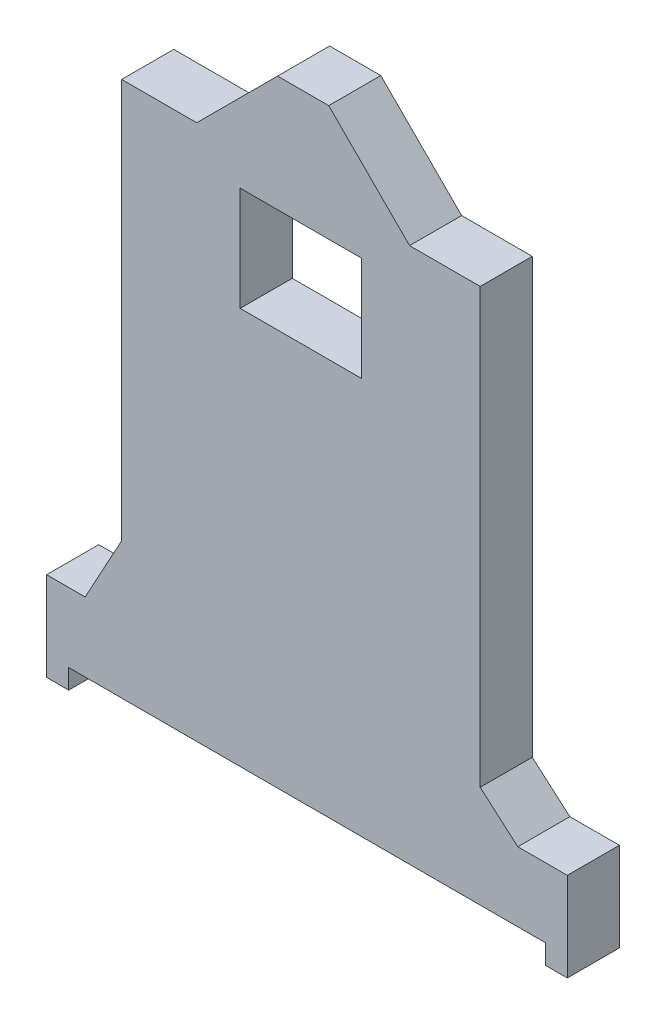
ISO-10303-21;
HEADER;
FILE_DESCRIPTION(('STEP AP214'),'2;1');
FILE_NAME('part.step','',(''),(''),'','','');
FILE_SCHEMA(('AUTOMOTIVE_DESIGN { 1 0 10303 214 1 1 1 1 }'));
ENDSEC;
DATA;
#1=APPLICATION_CONTEXT('core data for automotive mechanical design processes');
#2=APPLICATION_PROTOCOL_DEFINITION('international standard','automotive_design',2000,#1);
#3=PRODUCT_CONTEXT('',#1,'mechanical');
#4=PRODUCT('Part','Part','',(#3));
#5=PRODUCT_RELATED_PRODUCT_CATEGORY('part','',(#4));
#6=PRODUCT_DEFINITION_FORMATION('','',#4);
#7=PRODUCT_DEFINITION_CONTEXT('part definition',#1,'design');
#8=PRODUCT_DEFINITION('design','',#6,#7);
#9=PRODUCT_DEFINITION_SHAPE('','',#8);
#10=(LENGTH_UNIT() NAMED_UNIT(*) SI_UNIT(.MILLI.,.METRE.));
#11=(NAMED_UNIT(*) PLANE_ANGLE_UNIT() SI_UNIT($,.RADIAN.));
#12=(NAMED_UNIT(*) SI_UNIT($,.STERADIAN.) SOLID_ANGLE_UNIT());
#13=UNCERTAINTY_MEASURE_WITH_UNIT(LENGTH_MEASURE(1.E-05),#10,'distance_accuracy_value','');
#14=(GEOMETRIC_REPRESENTATION_CONTEXT(3) GLOBAL_UNCERTAINTY_ASSIGNED_CONTEXT((#13)) GLOBAL_UNIT_ASSIGNED_CONTEXT((#10,
#11,#12)) REPRESENTATION_CONTEXT('',''));
#15=CARTESIAN_POINT('',(0.,0.,0.));
#16=DIRECTION('',(0.,0.,1.));
#17=DIRECTION('',(1.,0.,0.));
#18=AXIS2_PLACEMENT_3D('',#15,#16,#17);
#19=CARTESIAN_POINT('',(461.082391295695,-1.67947600743342E-13,76.2));
#20=DIRECTION('',(1.,0.,0.));
#21=DIRECTION('',(0.,1.,0.));
#22=AXIS2_PLACEMENT_3D('',#19,#20,#21);
#23=PLANE('',#22);
#24=DIRECTION('',(0.,-1.,0.));
#25=VECTOR('',#24,1.);
#26=CARTESIAN_POINT('',(461.082391295695,-1.67947600743342E-13,0.));
#27=LINE('',#26,#25);
#28=CARTESIAN_POINT('',(461.082391295695,761.73124581928,0.));
#29=VERTEX_POINT('',#28);
#30=CARTESIAN_POINT('',(461.082391295695,609.33124581928,0.));
#31=VERTEX_POINT('',#30);
#32=EDGE_CURVE('E306',#29,#31,#27,.T.);
#33=ORIENTED_EDGE('',*,*,#32,.T.);
#34=DIRECTION('',(0.,0.,-1.));
#35=VECTOR('',#34,1.);
#36=CARTESIAN_POINT('',(461.082391295695,609.33124581928,76.2));
#37=LINE('',#36,#35);
#38=CARTESIAN_POINT('',(461.082391295695,609.33124581928,76.2));
#39=VERTEX_POINT('',#38);
#40=EDGE_CURVE('E111',#39,#31,#37,.T.);
#41=ORIENTED_EDGE('',*,*,#40,.F.);
#42=DIRECTION('',(0.,-1.,0.));
#43=VECTOR('',#42,1.);
#44=CARTESIAN_POINT('',(461.082391295695,-1.67947600743342E-13,76.2));
#45=LINE('',#44,#43);
#46=CARTESIAN_POINT('',(461.082391295695,761.73124581928,76.2));
#47=VERTEX_POINT('',#46);
#48=EDGE_CURVE('E443',#47,#39,#45,.T.);
#49=ORIENTED_EDGE('',*,*,#48,.F.);
#50=DIRECTION('',(0.,0.,-1.));
#51=VECTOR('',#50,1.);
#52=CARTESIAN_POINT('',(461.082391295695,761.73124581928,76.2));
#53=LINE('',#52,#51);
#54=EDGE_CURVE('E12',#47,#29,#53,.T.);
#55=ORIENTED_EDGE('',*,*,#54,.T.);
#56=EDGE_LOOP('',(#33,#41,#49,#55));
#57=FACE_BOUND('',#56,.T.);
#58=ADVANCED_FACE('F101',(#57),#23,.F.);
#59=CARTESIAN_POINT('',(0.,609.33124581928,76.2));
#60=DIRECTION('',(0.,1.,0.));
#61=DIRECTION('',(0.,0.,1.));
#62=AXIS2_PLACEMENT_3D('',#59,#60,#61);
#63=PLANE('',#62);
#64=DIRECTION('',(1.,0.,0.));
#65=VECTOR('',#64,1.);
#66=CARTESIAN_POINT('',(0.,609.33124581928,0.));
#67=LINE('',#66,#65);
#68=CARTESIAN_POINT('',(283.282391295695,609.33124581928,0.));
#69=VERTEX_POINT('',#68);
#70=EDGE_CURVE('E309',#69,#31,#67,.T.);
#71=ORIENTED_EDGE('',*,*,#70,.F.);
#72=DIRECTION('',(0.,0.,-1.));
#73=VECTOR('',#72,1.);
#74=CARTESIAN_POINT('',(283.282391295695,609.33124581928,76.2));
#75=LINE('',#74,#73);
#76=CARTESIAN_POINT('',(283.282391295695,609.33124581928,76.2));
#77=VERTEX_POINT('',#76);
#78=EDGE_CURVE('E317',#77,#69,#75,.T.);
#79=ORIENTED_EDGE('',*,*,#78,.F.);
#80=DIRECTION('',(1.,0.,0.));
#81=VECTOR('',#80,1.);
#82=CARTESIAN_POINT('',(0.,609.33124581928,76.2));
#83=LINE('',#82,#81);
#84=EDGE_CURVE('E448',#77,#39,#83,.T.);
#85=ORIENTED_EDGE('',*,*,#84,.T.);
#86=ORIENTED_EDGE('',*,*,#40,.T.);
#87=EDGE_LOOP('',(#71,#79,#85,#86));
#88=FACE_BOUND('',#87,.T.);
#89=ADVANCED_FACE('F455',(#88),#63,.T.);
#90=CARTESIAN_POINT('',(283.282391295695,1.03184590973541E-13,76.2));
#91=DIRECTION('',(1.,0.,0.));
#92=DIRECTION('',(0.,1.,0.));
#93=AXIS2_PLACEMENT_3D('',#90,#91,#92);
#94=PLANE('',#93);
#95=DIRECTION('',(0.,-1.,0.));
#96=VECTOR('',#95,1.);
#97=CARTESIAN_POINT('',(283.282391295695,1.03184590973541E-13,0.));
#98=LINE('',#97,#96);
#99=CARTESIAN_POINT('',(283.282391295695,761.73124581928,0.));
#100=VERTEX_POINT('',#99);
#101=EDGE_CURVE('E312',#100,#69,#98,.T.);
#102=ORIENTED_EDGE('',*,*,#101,.F.);
#103=DIRECTION('',(0.,0.,-1.));
#104=VECTOR('',#103,1.);
#105=CARTESIAN_POINT('',(283.282391295695,761.73124581928,76.2));
#106=LINE('',#105,#104);
#107=CARTESIAN_POINT('',(283.282391295695,761.73124581928,76.2));
#108=VERTEX_POINT('',#107);
#109=EDGE_CURVE('E120',#108,#100,#106,.T.);
#110=ORIENTED_EDGE('',*,*,#109,.F.);
#111=DIRECTION('',(0.,-1.,0.));
#112=VECTOR('',#111,1.);
#113=CARTESIAN_POINT('',(283.282391295695,1.03184590973541E-13,76.2));
#114=LINE('',#113,#112);
#115=EDGE_CURVE('E289',#108,#77,#114,.T.);
#116=ORIENTED_EDGE('',*,*,#115,.T.);
#117=ORIENTED_EDGE('',*,*,#78,.T.);
#118=EDGE_LOOP('',(#102,#110,#116,#117));
#119=FACE_BOUND('',#118,.T.);
#120=ADVANCED_FACE('F561',(#119),#94,.T.);
#121=CARTESIAN_POINT('',(0.,761.73124581928,76.2));
#122=DIRECTION('',(0.,1.,0.));
#123=DIRECTION('',(0.,0.,1.));
#124=AXIS2_PLACEMENT_3D('',#121,#122,#123);
#125=PLANE('',#124);
#126=DIRECTION('',(1.,0.,0.));
#127=VECTOR('',#126,1.);
#128=CARTESIAN_POINT('',(0.,761.73124581928,0.));
#129=LINE('',#128,#127);
#130=EDGE_CURVE('E303',#100,#29,#129,.T.);
#131=ORIENTED_EDGE('',*,*,#130,.T.);
#132=ORIENTED_EDGE('',*,*,#54,.F.);
#133=DIRECTION('',(1.,0.,0.));
#134=VECTOR('',#133,1.);
#135=CARTESIAN_POINT('',(0.,761.73124581928,76.2));
#136=LINE('',#135,#134);
#137=EDGE_CURVE('E449',#108,#47,#136,.T.);
#138=ORIENTED_EDGE('',*,*,#137,.F.);
#139=ORIENTED_EDGE('',*,*,#109,.T.);
#140=EDGE_LOOP('',(#131,#132,#138,#139));
#141=FACE_BOUND('',#140,.T.);
#142=ADVANCED_FACE('F565',(#141),#125,.F.);
#143=CARTESIAN_POINT('',(634.51829152491,0.,76.2));
#144=DIRECTION('',(-1.,0.,0.));
#145=DIRECTION('',(0.,0.,1.));
#146=AXIS2_PLACEMENT_3D('',#143,#144,#145);
#147=PLANE('',#146);
#148=DIRECTION('',(0.,1.,0.));
#149=VECTOR('',#148,1.);
#150=CARTESIAN_POINT('',(634.51829152491,0.,0.));
#151=LINE('',#150,#149);
#152=CARTESIAN_POINT('',(634.51829152491,177.963119360836,0.));
#153=VERTEX_POINT('',#152);
#154=CARTESIAN_POINT('',(634.51829152491,812.8,0.));
#155=VERTEX_POINT('',#154);
#156=EDGE_CURVE('E277',#153,#155,#151,.T.);
#157=ORIENTED_EDGE('',*,*,#156,.T.);
#158=DIRECTION('',(0.,0.,-1.));
#159=VECTOR('',#158,1.);
#160=CARTESIAN_POINT('',(634.51829152491,812.8,76.2));
#161=LINE('',#160,#159);
#162=CARTESIAN_POINT('',(634.51829152491,812.8,76.2));
#163=VERTEX_POINT('',#162);
#164=EDGE_CURVE('E333',#163,#155,#161,.T.);
#165=ORIENTED_EDGE('',*,*,#164,.F.);
#166=DIRECTION('',(0.,1.,0.));
#167=VECTOR('',#166,1.);
#168=CARTESIAN_POINT('',(634.51829152491,0.,76.2));
#169=LINE('',#168,#167);
#170=CARTESIAN_POINT('',(634.51829152491,177.963119360836,76.2));
#171=VERTEX_POINT('',#170);
#172=EDGE_CURVE('E315',#171,#163,#169,.T.);
#173=ORIENTED_EDGE('',*,*,#172,.F.);
#174=DIRECTION('',(0.,0.,-1.));
#175=VECTOR('',#174,1.);
#176=CARTESIAN_POINT('',(634.51829152491,177.963119360836,76.2));
#177=LINE('',#176,#175);
#178=EDGE_CURVE('E318',#171,#153,#177,.T.);
#179=ORIENTED_EDGE('',*,*,#178,.T.);
#180=EDGE_LOOP('',(#157,#165,#173,#179));
#181=FACE_BOUND('',#180,.T.);
#182=ADVANCED_FACE('F423',(#181),#147,.F.);
#183=CARTESIAN_POINT('',(0.,812.8,76.2));
#184=DIRECTION('',(0.,1.,0.));
#185=DIRECTION('',(0.,0.,1.));
#186=AXIS2_PLACEMENT_3D('',#183,#184,#185);
#187=PLANE('',#186);
#188=DIRECTION('',(1.,0.,0.));
#189=VECTOR('',#188,1.);
#190=CARTESIAN_POINT('',(0.,812.8,0.));
#191=LINE('',#190,#189);
#192=CARTESIAN_POINT('',(531.162645998709,812.8,0.));
#193=VERTEX_POINT('',#192);
#194=EDGE_CURVE('E280',#193,#155,#191,.T.);
#195=ORIENTED_EDGE('',*,*,#194,.F.);
#196=DIRECTION('',(0.,0.,-1.));
#197=VECTOR('',#196,1.);
#198=CARTESIAN_POINT('',(531.162645998709,812.8,76.2));
#199=LINE('',#198,#197);
#200=CARTESIAN_POINT('',(531.162645998709,812.8,76.2));
#201=VERTEX_POINT('',#200);
#202=EDGE_CURVE('E331',#201,#193,#199,.T.);
#203=ORIENTED_EDGE('',*,*,#202,.F.);
#204=DIRECTION('',(1.,0.,0.));
#205=VECTOR('',#204,1.);
#206=CARTESIAN_POINT('',(0.,812.8,76.2));
#207=LINE('',#206,#205);
#208=EDGE_CURVE('E421',#201,#163,#207,.T.);
#209=ORIENTED_EDGE('',*,*,#208,.T.);
#210=ORIENTED_EDGE('',*,*,#164,.T.);
#211=EDGE_LOOP('',(#195,#203,#209,#210));
#212=FACE_BOUND('',#211,.T.);
#213=ADVANCED_FACE('F416',(#212),#187,.T.);
#214=CARTESIAN_POINT('',(671.981322999355,671.981322999354,76.2));
#215=DIRECTION('',(0.707106781186548,0.707106781186547,0.));
#216=DIRECTION('',(-0.707106781186547,0.707106781186548,0.));
#217=AXIS2_PLACEMENT_3D('',#214,#215,#216);
#218=PLANE('',#217);
#219=DIRECTION('',(0.707106781186547,-0.707106781186548,0.));
#220=VECTOR('',#219,1.);
#221=CARTESIAN_POINT('',(671.981322999355,671.981322999354,0.));
#222=LINE('',#221,#220);
#223=CARTESIAN_POINT('',(412.853551647153,931.109094351556,0.));
#224=VERTEX_POINT('',#223);
#225=EDGE_CURVE('E285',#224,#193,#222,.T.);
#226=ORIENTED_EDGE('',*,*,#225,.F.);
#227=DIRECTION('',(0.,0.,-1.));
#228=VECTOR('',#227,1.);
#229=CARTESIAN_POINT('',(412.853551647153,931.109094351556,76.2));
#230=LINE('',#229,#228);
#231=CARTESIAN_POINT('',(412.853551647153,931.109094351556,76.2));
#232=VERTEX_POINT('',#231);
#233=EDGE_CURVE('E329',#232,#224,#230,.T.);
#234=ORIENTED_EDGE('',*,*,#233,.F.);
#235=DIRECTION('',(0.707106781186547,-0.707106781186548,0.));
#236=VECTOR('',#235,1.);
#237=CARTESIAN_POINT('',(671.981322999355,671.981322999354,76.2));
#238=LINE('',#237,#236);
#239=EDGE_CURVE('E462',#232,#201,#238,.T.);
#240=ORIENTED_EDGE('',*,*,#239,.T.);
#241=ORIENTED_EDGE('',*,*,#202,.T.);
#242=EDGE_LOOP('',(#226,#234,#240,#241));
#243=FACE_BOUND('',#242,.T.);
#244=ADVANCED_FACE('F412',(#243),#218,.T.);
#245=CARTESIAN_POINT('',(2.7598420475467E-12,931.109094351557,76.2));
#246=DIRECTION('',(0.,1.,0.));
#247=DIRECTION('',(-1.,0.,0.));
#248=AXIS2_PLACEMENT_3D('',#245,#246,#247);
#249=PLANE('',#248);
#250=DIRECTION('',(1.,0.,0.));
#251=VECTOR('',#250,1.);
#252=CARTESIAN_POINT('',(2.7598420475467E-12,931.109094351557,0.));
#253=LINE('',#252,#251);
#254=CARTESIAN_POINT('',(337.940659012164,931.109094351556,0.));
#255=VERTEX_POINT('',#254);
#256=EDGE_CURVE('E294',#255,#224,#253,.T.);
#257=ORIENTED_EDGE('',*,*,#256,.F.);
#258=DIRECTION('',(0.,0.,-1.));
#259=VECTOR('',#258,1.);
#260=CARTESIAN_POINT('',(337.940659012164,931.109094351556,76.2));
#261=LINE('',#260,#259);
#262=CARTESIAN_POINT('',(337.940659012164,931.109094351556,76.2));
#263=VERTEX_POINT('',#262);
#264=EDGE_CURVE('E327',#263,#255,#261,.T.);
#265=ORIENTED_EDGE('',*,*,#264,.F.);
#266=DIRECTION('',(1.,0.,0.));
#267=VECTOR('',#266,1.);
#268=CARTESIAN_POINT('',(2.7598420475467E-12,931.109094351557,76.2));
#269=LINE('',#268,#267);
#270=EDGE_CURVE('E408',#263,#232,#269,.T.);
#271=ORIENTED_EDGE('',*,*,#270,.T.);
#272=ORIENTED_EDGE('',*,*,#233,.T.);
#273=EDGE_LOOP('',(#257,#265,#271,#272));
#274=FACE_BOUND('',#273,.T.);
#275=ADVANCED_FACE('F404',(#274),#249,.T.);
#276=CARTESIAN_POINT('',(-296.584217669696,296.584217669696,76.2));
#277=DIRECTION('',(-0.707106781186548,0.707106781186547,0.));
#278=DIRECTION('',(-0.707106781186547,-0.707106781186548,0.));
#279=AXIS2_PLACEMENT_3D('',#276,#277,#278);
#280=PLANE('',#279);
#281=DIRECTION('',(0.707106781186547,0.707106781186548,0.));
#282=VECTOR('',#281,1.);
#283=CARTESIAN_POINT('',(-296.584217669696,296.584217669696,0.));
#284=LINE('',#283,#282);
#285=CARTESIAN_POINT('',(219.631564660608,812.8,0.));
#286=VERTEX_POINT('',#285);
#287=EDGE_CURVE('E297',#286,#255,#284,.T.);
#288=ORIENTED_EDGE('',*,*,#287,.F.);
#289=DIRECTION('',(0.,0.,-1.));
#290=VECTOR('',#289,1.);
#291=CARTESIAN_POINT('',(219.631564660608,812.8,76.2));
#292=LINE('',#291,#290);
#293=CARTESIAN_POINT('',(219.631564660608,812.8,76.2));
#294=VERTEX_POINT('',#293);
#295=EDGE_CURVE('E325',#294,#286,#292,.T.);
#296=ORIENTED_EDGE('',*,*,#295,.F.);
#297=DIRECTION('',(0.707106781186547,0.707106781186548,0.));
#298=VECTOR('',#297,1.);
#299=CARTESIAN_POINT('',(-296.584217669696,296.584217669696,76.2));
#300=LINE('',#299,#298);
#301=EDGE_CURVE('E400',#294,#263,#300,.T.);
#302=ORIENTED_EDGE('',*,*,#301,.T.);
#303=ORIENTED_EDGE('',*,*,#264,.T.);
#304=EDGE_LOOP('',(#288,#296,#302,#303));
#305=FACE_BOUND('',#304,.T.);
#306=ADVANCED_FACE('F394',(#305),#280,.T.);
#307=CARTESIAN_POINT('',(109.84649106648,812.8,0.));
#308=VERTEX_POINT('',#307);
#309=EDGE_CURVE('E287',#308,#286,#191,.T.);
#310=ORIENTED_EDGE('',*,*,#309,.F.);
#311=DIRECTION('',(0.,0.,-1.));
#312=VECTOR('',#311,1.);
#313=CARTESIAN_POINT('',(109.84649106648,812.8,76.2));
#314=LINE('',#313,#312);
#315=CARTESIAN_POINT('',(109.84649106648,812.8,76.2));
#316=VERTEX_POINT('',#315);
#317=EDGE_CURVE('E323',#316,#308,#314,.T.);
#318=ORIENTED_EDGE('',*,*,#317,.F.);
#319=EDGE_CURVE('E459',#316,#294,#207,.T.);
#320=ORIENTED_EDGE('',*,*,#319,.T.);
#321=ORIENTED_EDGE('',*,*,#295,.T.);
#322=EDGE_LOOP('',(#310,#318,#320,#321));
#323=FACE_BOUND('',#322,.T.);
#324=ADVANCED_FACE('F389',(#323),#187,.T.);
#325=CARTESIAN_POINT('',(109.84649106648,0.,76.2));
#326=DIRECTION('',(-1.,0.,0.));
#327=DIRECTION('',(0.,0.,1.));
#328=AXIS2_PLACEMENT_3D('',#325,#326,#327);
#329=PLANE('',#328);
#330=DIRECTION('',(0.,1.,0.));
#331=VECTOR('',#330,1.);
#332=CARTESIAN_POINT('',(109.84649106648,0.,0.));
#333=LINE('',#332,#331);
#334=CARTESIAN_POINT('',(109.84649106648,228.180400099256,0.));
#335=VERTEX_POINT('',#334);
#336=EDGE_CURVE('E300',#335,#308,#333,.T.);
#337=ORIENTED_EDGE('',*,*,#336,.F.);
#338=DIRECTION('',(0.,0.,-1.));
#339=VECTOR('',#338,1.);
#340=CARTESIAN_POINT('',(109.84649106648,228.180400099256,76.2));
#341=LINE('',#340,#339);
#342=CARTESIAN_POINT('',(109.84649106648,228.180400099256,76.2));
#343=VERTEX_POINT('',#342);
#344=EDGE_CURVE('E321',#343,#335,#341,.T.);
#345=ORIENTED_EDGE('',*,*,#344,.F.);
#346=DIRECTION('',(0.,1.,0.));
#347=VECTOR('',#346,1.);
#348=CARTESIAN_POINT('',(109.84649106648,0.,76.2));
#349=LINE('',#348,#347);
#350=EDGE_CURVE('E385',#343,#316,#349,.T.);
#351=ORIENTED_EDGE('',*,*,#350,.T.);
#352=ORIENTED_EDGE('',*,*,#317,.T.);
#353=EDGE_LOOP('',(#337,#345,#351,#352));
#354=FACE_BOUND('',#353,.T.);
#355=ADVANCED_FACE('F378',(#354),#329,.T.);
#356=CARTESIAN_POINT('',(0.,0.,0.));
#357=DIRECTION('',(0.,0.,1.));
#358=DIRECTION('',(1.,0.,0.));
#359=AXIS2_PLACEMENT_3D('',#356,#357,#358);
#360=PLANE('',#359);
#361=ORIENTED_EDGE('',*,*,#156,.F.);
#362=DIRECTION('',(0.754704283646868,-0.65606512195442,0.));
#363=VECTOR('',#362,1.);
#364=CARTESIAN_POINT('',(345.21695497783,429.453035021824,0.));
#365=LINE('',#364,#363);
#366=CARTESIAN_POINT('',(689.530233430878,130.141188099113,0.));
#367=VERTEX_POINT('',#366);
#368=EDGE_CURVE('E370',#153,#367,#365,.T.);
#369=ORIENTED_EDGE('',*,*,#368,.T.);
#370=DIRECTION('',(1.,0.,0.));
#371=VECTOR('',#370,1.);
#372=CARTESIAN_POINT('',(689.530233430878,130.141188099113,0.));
#373=LINE('',#372,#371);
#374=CARTESIAN_POINT('',(762.,130.141188099113,0.));
#375=VERTEX_POINT('',#374);
#376=EDGE_CURVE('E367',#367,#375,#373,.T.);
#377=ORIENTED_EDGE('',*,*,#376,.T.);
#378=DIRECTION('',(0.,1.,0.));
#379=VECTOR('',#378,1.);
#380=CARTESIAN_POINT('',(762.,0.,0.));
#381=LINE('',#380,#379);
#382=CARTESIAN_POINT('',(762.,0.,0.));
#383=VERTEX_POINT('',#382);
#384=EDGE_CURVE('E364',#383,#375,#381,.T.);
#385=ORIENTED_EDGE('',*,*,#384,.F.);
#386=DIRECTION('',(1.,0.,0.));
#387=VECTOR('',#386,1.);
#388=CARTESIAN_POINT('',(729.742,0.,0.));
#389=LINE('',#388,#387);
#390=CARTESIAN_POINT('',(729.742,0.,0.));
#391=VERTEX_POINT('',#390);
#392=EDGE_CURVE('E362',#391,#383,#389,.T.);
#393=ORIENTED_EDGE('',*,*,#392,.F.);
#394=DIRECTION('',(0.,-1.,0.));
#395=VECTOR('',#394,1.);
#396=CARTESIAN_POINT('',(729.742,28.6263309260255,0.));
#397=LINE('',#396,#395);
#398=CARTESIAN_POINT('',(729.742,28.6263309260255,0.));
#399=VERTEX_POINT('',#398);
#400=EDGE_CURVE('E360',#399,#391,#397,.T.);
#401=ORIENTED_EDGE('',*,*,#400,.F.);
#402=DIRECTION('',(1.,0.,0.));
#403=VECTOR('',#402,1.);
#404=CARTESIAN_POINT('',(32.3000241040864,28.6263309260255,0.));
#405=LINE('',#404,#403);
#406=CARTESIAN_POINT('',(32.3000241040864,28.6263309260255,0.));
#407=VERTEX_POINT('',#406);
#408=EDGE_CURVE('E358',#407,#399,#405,.T.);
#409=ORIENTED_EDGE('',*,*,#408,.F.);
#410=DIRECTION('',(0.,1.,0.));
#411=VECTOR('',#410,1.);
#412=CARTESIAN_POINT('',(32.3000241040864,0.,0.));
#413=LINE('',#412,#411);
#414=CARTESIAN_POINT('',(32.3000241040864,0.,0.));
#415=VERTEX_POINT('',#414);
#416=EDGE_CURVE('E244',#415,#407,#413,.T.);
#417=ORIENTED_EDGE('',*,*,#416,.F.);
#418=DIRECTION('',(1.,0.,0.));
#419=VECTOR('',#418,1.);
#420=CARTESIAN_POINT('',(0.,0.,0.));
#421=LINE('',#420,#419);
#422=CARTESIAN_POINT('',(0.,0.,0.));
#423=VERTEX_POINT('',#422);
#424=EDGE_CURVE('E230',#423,#415,#421,.T.);
#425=ORIENTED_EDGE('',*,*,#424,.F.);
#426=DIRECTION('',(0.,1.,0.));
#427=VECTOR('',#426,1.);
#428=CARTESIAN_POINT('',(0.,0.,0.));
#429=LINE('',#428,#427);
#430=CARTESIAN_POINT('',(0.,130.141188099113,0.));
#431=VERTEX_POINT('',#430);
#432=EDGE_CURVE('E242',#423,#431,#429,.T.);
#433=ORIENTED_EDGE('',*,*,#432,.T.);
#434=DIRECTION('',(1.,0.,0.));
#435=VECTOR('',#434,1.);
#436=CARTESIAN_POINT('',(0.,130.141188099113,0.));
#437=LINE('',#436,#435);
#438=CARTESIAN_POINT('',(56.3705572482205,130.141188099113,0.));
#439=VERTEX_POINT('',#438);
#440=EDGE_CURVE('E248',#431,#439,#437,.T.);
#441=ORIENTED_EDGE('',*,*,#440,.T.);
#442=DIRECTION('',(0.478852130680573,0.877895572914384,0.));
#443=VECTOR('',#442,1.);
#444=CARTESIAN_POINT('',(56.3705572482205,130.141188099113,0.));
#445=LINE('',#444,#443);
#446=EDGE_CURVE('E252',#439,#335,#445,.T.);
#447=ORIENTED_EDGE('',*,*,#446,.T.);
#448=ORIENTED_EDGE('',*,*,#336,.T.);
#449=ORIENTED_EDGE('',*,*,#309,.T.);
#450=ORIENTED_EDGE('',*,*,#287,.T.);
#451=ORIENTED_EDGE('',*,*,#256,.T.);
#452=ORIENTED_EDGE('',*,*,#225,.T.);
#453=ORIENTED_EDGE('',*,*,#194,.T.);
#454=EDGE_LOOP('',(#361,#369,#377,#385,#393,#401,#409,#417,#425,#433,#441,#447,#448,#449,#450,
#451,#452,#453));
#455=FACE_BOUND('',#454,.T.);
#456=ORIENTED_EDGE('',*,*,#130,.F.);
#457=ORIENTED_EDGE('',*,*,#101,.T.);
#458=ORIENTED_EDGE('',*,*,#70,.T.);
#459=ORIENTED_EDGE('',*,*,#32,.F.);
#460=EDGE_LOOP('',(#456,#457,#458,#459));
#461=FACE_BOUND('',#460,.T.);
#462=ADVANCED_FACE('F239',(#455,#461),#360,.F.);
#463=CARTESIAN_POINT('',(0.,0.,76.2));
#464=DIRECTION('',(0.,0.,1.));
#465=DIRECTION('',(1.,0.,0.));
#466=AXIS2_PLACEMENT_3D('',#463,#464,#465);
#467=PLANE('',#466);
#468=DIRECTION('',(0.754704283646868,-0.65606512195442,0.));
#469=VECTOR('',#468,1.);
#470=CARTESIAN_POINT('',(345.21695497783,429.453035021824,76.2));
#471=LINE('',#470,#469);
#472=CARTESIAN_POINT('',(689.530233430878,130.141188099113,76.2));
#473=VERTEX_POINT('',#472);
#474=EDGE_CURVE('E348',#171,#473,#471,.T.);
#475=ORIENTED_EDGE('',*,*,#474,.F.);
#476=ORIENTED_EDGE('',*,*,#172,.T.);
#477=ORIENTED_EDGE('',*,*,#208,.F.);
#478=ORIENTED_EDGE('',*,*,#239,.F.);
#479=ORIENTED_EDGE('',*,*,#270,.F.);
#480=ORIENTED_EDGE('',*,*,#301,.F.);
#481=ORIENTED_EDGE('',*,*,#319,.F.);
#482=ORIENTED_EDGE('',*,*,#350,.F.);
#483=DIRECTION('',(0.478852130680573,0.877895572914384,0.));
#484=VECTOR('',#483,1.);
#485=CARTESIAN_POINT('',(56.3705572482205,130.141188099113,76.2));
#486=LINE('',#485,#484);
#487=CARTESIAN_POINT('',(56.3705572482205,130.141188099113,76.2));
#488=VERTEX_POINT('',#487);
#489=EDGE_CURVE('E350',#488,#343,#486,.T.);
#490=ORIENTED_EDGE('',*,*,#489,.F.);
#491=DIRECTION('',(1.,0.,0.));
#492=VECTOR('',#491,1.);
#493=CARTESIAN_POINT('',(0.,130.141188099113,76.2));
#494=LINE('',#493,#492);
#495=CARTESIAN_POINT('',(0.,130.141188099113,76.2));
#496=VERTEX_POINT('',#495);
#497=EDGE_CURVE('E353',#496,#488,#494,.T.);
#498=ORIENTED_EDGE('',*,*,#497,.F.);
#499=DIRECTION('',(0.,1.,0.));
#500=VECTOR('',#499,1.);
#501=CARTESIAN_POINT('',(0.,0.,76.2));
#502=LINE('',#501,#500);
#503=CARTESIAN_POINT('',(0.,0.,76.2));
#504=VERTEX_POINT('',#503);
#505=EDGE_CURVE('E234',#504,#496,#502,.T.);
#506=ORIENTED_EDGE('',*,*,#505,.F.);
#507=DIRECTION('',(1.,0.,0.));
#508=VECTOR('',#507,1.);
#509=CARTESIAN_POINT('',(0.,0.,76.2));
#510=LINE('',#509,#508);
#511=CARTESIAN_POINT('',(32.3000241040864,0.,76.2));
#512=VERTEX_POINT('',#511);
#513=EDGE_CURVE('E232',#504,#512,#510,.T.);
#514=ORIENTED_EDGE('',*,*,#513,.T.);
#515=DIRECTION('',(0.,1.,0.));
#516=VECTOR('',#515,1.);
#517=CARTESIAN_POINT('',(32.3000241040864,0.,76.2));
#518=LINE('',#517,#516);
#519=CARTESIAN_POINT('',(32.3000241040864,28.6263309260255,76.2));
#520=VERTEX_POINT('',#519);
#521=EDGE_CURVE('E250',#512,#520,#518,.T.);
#522=ORIENTED_EDGE('',*,*,#521,.T.);
#523=DIRECTION('',(1.,0.,0.));
#524=VECTOR('',#523,1.);
#525=CARTESIAN_POINT('',(32.3000241040864,28.6263309260255,76.2));
#526=LINE('',#525,#524);
#527=CARTESIAN_POINT('',(729.742,28.6263309260255,76.2));
#528=VERTEX_POINT('',#527);
#529=EDGE_CURVE('E337',#520,#528,#526,.T.);
#530=ORIENTED_EDGE('',*,*,#529,.T.);
#531=DIRECTION('',(0.,-1.,0.));
#532=VECTOR('',#531,1.);
#533=CARTESIAN_POINT('',(729.742,28.6263309260255,76.2));
#534=LINE('',#533,#532);
#535=CARTESIAN_POINT('',(729.742,0.,76.2));
#536=VERTEX_POINT('',#535);
#537=EDGE_CURVE('E339',#528,#536,#534,.T.);
#538=ORIENTED_EDGE('',*,*,#537,.T.);
#539=DIRECTION('',(1.,0.,0.));
#540=VECTOR('',#539,1.);
#541=CARTESIAN_POINT('',(729.742,0.,76.2));
#542=LINE('',#541,#540);
#543=CARTESIAN_POINT('',(762.,0.,76.2));
#544=VERTEX_POINT('',#543);
#545=EDGE_CURVE('E341',#536,#544,#542,.T.);
#546=ORIENTED_EDGE('',*,*,#545,.T.);
#547=DIRECTION('',(0.,1.,0.));
#548=VECTOR('',#547,1.);
#549=CARTESIAN_POINT('',(762.,0.,76.2));
#550=LINE('',#549,#548);
#551=CARTESIAN_POINT('',(762.,130.141188099113,76.2));
#552=VERTEX_POINT('',#551);
#553=EDGE_CURVE('E343',#544,#552,#550,.T.);
#554=ORIENTED_EDGE('',*,*,#553,.T.);
#555=DIRECTION('',(1.,0.,0.));
#556=VECTOR('',#555,1.);
#557=CARTESIAN_POINT('',(689.530233430878,130.141188099113,76.2));
#558=LINE('',#557,#556);
#559=EDGE_CURVE('E345',#473,#552,#558,.T.);
#560=ORIENTED_EDGE('',*,*,#559,.F.);
#561=EDGE_LOOP('',(#475,#476,#477,#478,#479,#480,#481,#482,#490,#498,#506,#514,#522,#530,#538,
#546,#554,#560));
#562=FACE_BOUND('',#561,.T.);
#563=ORIENTED_EDGE('',*,*,#137,.T.);
#564=ORIENTED_EDGE('',*,*,#48,.T.);
#565=ORIENTED_EDGE('',*,*,#84,.F.);
#566=ORIENTED_EDGE('',*,*,#115,.F.);
#567=EDGE_LOOP('',(#563,#564,#565,#566));
#568=FACE_BOUND('',#567,.T.);
#569=ADVANCED_FACE('F445',(#562,#568),#467,.T.);
#570=CARTESIAN_POINT('',(32.3000241040864,0.,76.2));
#571=DIRECTION('',(-1.,0.,0.));
#572=DIRECTION('',(0.,0.,1.));
#573=AXIS2_PLACEMENT_3D('',#570,#571,#572);
#574=PLANE('',#573);
#575=ORIENTED_EDGE('',*,*,#416,.T.);
#576=DIRECTION('',(0.,0.,-1.));
#577=VECTOR('',#576,1.);
#578=CARTESIAN_POINT('',(32.3000241040864,28.6263309260255,76.2));
#579=LINE('',#578,#577);
#580=EDGE_CURVE('E272',#520,#407,#579,.T.);
#581=ORIENTED_EDGE('',*,*,#580,.F.);
#582=ORIENTED_EDGE('',*,*,#521,.F.);
#583=DIRECTION('',(0.,0.,-1.));
#584=VECTOR('',#583,1.);
#585=CARTESIAN_POINT('',(32.3000241040864,0.,76.2));
#586=LINE('',#585,#584);
#587=EDGE_CURVE('E105',#512,#415,#586,.T.);
#588=ORIENTED_EDGE('',*,*,#587,.T.);
#589=EDGE_LOOP('',(#575,#581,#582,#588));
#590=FACE_BOUND('',#589,.T.);
#591=ADVANCED_FACE('F481',(#590),#574,.F.);
#592=CARTESIAN_POINT('',(32.3000241040864,28.6263309260255,76.2));
#593=DIRECTION('',(0.,1.,0.));
#594=DIRECTION('',(0.,0.,1.));
#595=AXIS2_PLACEMENT_3D('',#592,#593,#594);
#596=PLANE('',#595);
#597=ORIENTED_EDGE('',*,*,#408,.T.);
#598=DIRECTION('',(0.,0.,-1.));
#599=VECTOR('',#598,1.);
#600=CARTESIAN_POINT('',(729.742,28.6263309260255,76.2));
#601=LINE('',#600,#599);
#602=EDGE_CURVE('E270',#528,#399,#601,.T.);
#603=ORIENTED_EDGE('',*,*,#602,.F.);
#604=ORIENTED_EDGE('',*,*,#529,.F.);
#605=ORIENTED_EDGE('',*,*,#580,.T.);
#606=EDGE_LOOP('',(#597,#603,#604,#605));
#607=FACE_BOUND('',#606,.T.);
#608=ADVANCED_FACE('F483',(#607),#596,.F.);
#609=CARTESIAN_POINT('',(729.742,28.6263309260255,76.2));
#610=DIRECTION('',(1.,0.,0.));
#611=DIRECTION('',(0.,0.,-1.));
#612=AXIS2_PLACEMENT_3D('',#609,#610,#611);
#613=PLANE('',#612);
#614=ORIENTED_EDGE('',*,*,#400,.T.);
#615=DIRECTION('',(0.,0.,-1.));
#616=VECTOR('',#615,1.);
#617=CARTESIAN_POINT('',(729.742,0.,76.2));
#618=LINE('',#617,#616);
#619=EDGE_CURVE('E267',#536,#391,#618,.T.);
#620=ORIENTED_EDGE('',*,*,#619,.F.);
#621=ORIENTED_EDGE('',*,*,#537,.F.);
#622=ORIENTED_EDGE('',*,*,#602,.T.);
#623=EDGE_LOOP('',(#614,#620,#621,#622));
#624=FACE_BOUND('',#623,.T.);
#625=ADVANCED_FACE('F488',(#624),#613,.F.);
#626=CARTESIAN_POINT('',(729.742,0.,76.2));
#627=DIRECTION('',(0.,1.,0.));
#628=DIRECTION('',(0.,0.,1.));
#629=AXIS2_PLACEMENT_3D('',#626,#627,#628);
#630=PLANE('',#629);
#631=ORIENTED_EDGE('',*,*,#392,.T.);
#632=DIRECTION('',(0.,0.,-1.));
#633=VECTOR('',#632,1.);
#634=CARTESIAN_POINT('',(762.,0.,76.2));
#635=LINE('',#634,#633);
#636=EDGE_CURVE('E264',#544,#383,#635,.T.);
#637=ORIENTED_EDGE('',*,*,#636,.F.);
#638=ORIENTED_EDGE('',*,*,#545,.F.);
#639=ORIENTED_EDGE('',*,*,#619,.T.);
#640=EDGE_LOOP('',(#631,#637,#638,#639));
#641=FACE_BOUND('',#640,.T.);
#642=ADVANCED_FACE('F494',(#641),#630,.F.);
#643=CARTESIAN_POINT('',(762.,0.,76.2));
#644=DIRECTION('',(-1.,0.,0.));
#645=DIRECTION('',(0.,0.,1.));
#646=AXIS2_PLACEMENT_3D('',#643,#644,#645);
#647=PLANE('',#646);
#648=ORIENTED_EDGE('',*,*,#384,.T.);
#649=DIRECTION('',(0.,0.,-1.));
#650=VECTOR('',#649,1.);
#651=CARTESIAN_POINT('',(762.,130.141188099113,76.2));
#652=LINE('',#651,#650);
#653=EDGE_CURVE('E262',#552,#375,#652,.T.);
#654=ORIENTED_EDGE('',*,*,#653,.F.);
#655=ORIENTED_EDGE('',*,*,#553,.F.);
#656=ORIENTED_EDGE('',*,*,#636,.T.);
#657=EDGE_LOOP('',(#648,#654,#655,#656));
#658=FACE_BOUND('',#657,.T.);
#659=ADVANCED_FACE('F498',(#658),#647,.F.);
#660=CARTESIAN_POINT('',(689.530233430878,130.141188099113,76.2));
#661=DIRECTION('',(0.,1.,0.));
#662=DIRECTION('',(0.,0.,1.));
#663=AXIS2_PLACEMENT_3D('',#660,#661,#662);
#664=PLANE('',#663);
#665=ORIENTED_EDGE('',*,*,#376,.F.);
#666=DIRECTION('',(0.,0.,-1.));
#667=VECTOR('',#666,1.);
#668=CARTESIAN_POINT('',(689.530233430878,130.141188099113,76.2));
#669=LINE('',#668,#667);
#670=EDGE_CURVE('E259',#473,#367,#669,.T.);
#671=ORIENTED_EDGE('',*,*,#670,.F.);
#672=ORIENTED_EDGE('',*,*,#559,.T.);
#673=ORIENTED_EDGE('',*,*,#653,.T.);
#674=EDGE_LOOP('',(#665,#671,#672,#673));
#675=FACE_BOUND('',#674,.T.);
#676=ADVANCED_FACE('F478',(#675),#664,.T.);
#677=CARTESIAN_POINT('',(345.21695497783,429.453035021824,76.2));
#678=DIRECTION('',(0.65606512195442,0.754704283646868,0.));
#679=DIRECTION('',(-0.754704283646868,0.65606512195442,0.));
#680=AXIS2_PLACEMENT_3D('',#677,#678,#679);
#681=PLANE('',#680);
#682=ORIENTED_EDGE('',*,*,#178,.F.);
#683=ORIENTED_EDGE('',*,*,#474,.T.);
#684=ORIENTED_EDGE('',*,*,#670,.T.);
#685=ORIENTED_EDGE('',*,*,#368,.F.);
#686=EDGE_LOOP('',(#682,#683,#684,#685));
#687=FACE_BOUND('',#686,.T.);
#688=ADVANCED_FACE('F471',(#687),#681,.T.);
#689=CARTESIAN_POINT('',(56.3705572482205,130.141188099113,76.2));
#690=DIRECTION('',(-0.877895572914384,0.478852130680573,0.));
#691=DIRECTION('',(-0.478852130680573,-0.877895572914384,0.));
#692=AXIS2_PLACEMENT_3D('',#689,#690,#691);
#693=PLANE('',#692);
#694=ORIENTED_EDGE('',*,*,#489,.T.);
#695=ORIENTED_EDGE('',*,*,#344,.T.);
#696=ORIENTED_EDGE('',*,*,#446,.F.);
#697=DIRECTION('',(0.,0.,-1.));
#698=VECTOR('',#697,1.);
#699=CARTESIAN_POINT('',(56.3705572482205,130.141188099113,76.2));
#700=LINE('',#699,#698);
#701=EDGE_CURVE('E257',#488,#439,#700,.T.);
#702=ORIENTED_EDGE('',*,*,#701,.F.);
#703=EDGE_LOOP('',(#694,#695,#696,#702));
#704=FACE_BOUND('',#703,.T.);
#705=ADVANCED_FACE('F469',(#704),#693,.T.);
#706=CARTESIAN_POINT('',(0.,130.141188099113,76.2));
#707=DIRECTION('',(0.,1.,0.));
#708=DIRECTION('',(0.,0.,1.));
#709=AXIS2_PLACEMENT_3D('',#706,#707,#708);
#710=PLANE('',#709);
#711=ORIENTED_EDGE('',*,*,#440,.F.);
#712=DIRECTION('',(0.,0.,-1.));
#713=VECTOR('',#712,1.);
#714=CARTESIAN_POINT('',(0.,130.141188099113,76.2));
#715=LINE('',#714,#713);
#716=EDGE_CURVE('E221',#496,#431,#715,.T.);
#717=ORIENTED_EDGE('',*,*,#716,.F.);
#718=ORIENTED_EDGE('',*,*,#497,.T.);
#719=ORIENTED_EDGE('',*,*,#701,.T.);
#720=EDGE_LOOP('',(#711,#717,#718,#719));
#721=FACE_BOUND('',#720,.T.);
#722=ADVANCED_FACE('F468',(#721),#710,.T.);
#723=CARTESIAN_POINT('',(0.,0.,76.2));
#724=DIRECTION('',(-1.,0.,0.));
#725=DIRECTION('',(0.,0.,1.));
#726=AXIS2_PLACEMENT_3D('',#723,#724,#725);
#727=PLANE('',#726);
#728=ORIENTED_EDGE('',*,*,#432,.F.);
#729=DIRECTION('',(0.,0.,-1.));
#730=VECTOR('',#729,1.);
#731=CARTESIAN_POINT('',(0.,0.,76.2));
#732=LINE('',#731,#730);
#733=EDGE_CURVE('E227',#504,#423,#732,.T.);
#734=ORIENTED_EDGE('',*,*,#733,.F.);
#735=ORIENTED_EDGE('',*,*,#505,.T.);
#736=ORIENTED_EDGE('',*,*,#716,.T.);
#737=EDGE_LOOP('',(#728,#734,#735,#736));
#738=FACE_BOUND('',#737,.T.);
#739=ADVANCED_FACE('F247',(#738),#727,.T.);
#740=CARTESIAN_POINT('',(0.,0.,76.2));
#741=DIRECTION('',(0.,1.,0.));
#742=DIRECTION('',(0.,0.,1.));
#743=AXIS2_PLACEMENT_3D('',#740,#741,#742);
#744=PLANE('',#743);
#745=ORIENTED_EDGE('',*,*,#424,.T.);
#746=ORIENTED_EDGE('',*,*,#587,.F.);
#747=ORIENTED_EDGE('',*,*,#513,.F.);
#748=ORIENTED_EDGE('',*,*,#733,.T.);
#749=EDGE_LOOP('',(#745,#746,#747,#748));
#750=FACE_BOUND('',#749,.T.);
#751=ADVANCED_FACE('F103',(#750),#744,.F.);
#752=CLOSED_SHELL('',(#58,#89,#120,#142,#182,#213,#244,#275,#306,#324,#355,#462,#569,#591,#608,
#625,#642,#659,#676,#688,#705,#722,#739,#751));
#753=MANIFOLD_SOLID_BREP('B2',#752);
#754=ADVANCED_BREP_SHAPE_REPRESENTATION('',(#18,#753),#14);
#755=SHAPE_DEFINITION_REPRESENTATION(#9,#754);
ENDSEC;
END-ISO-10303-21;
